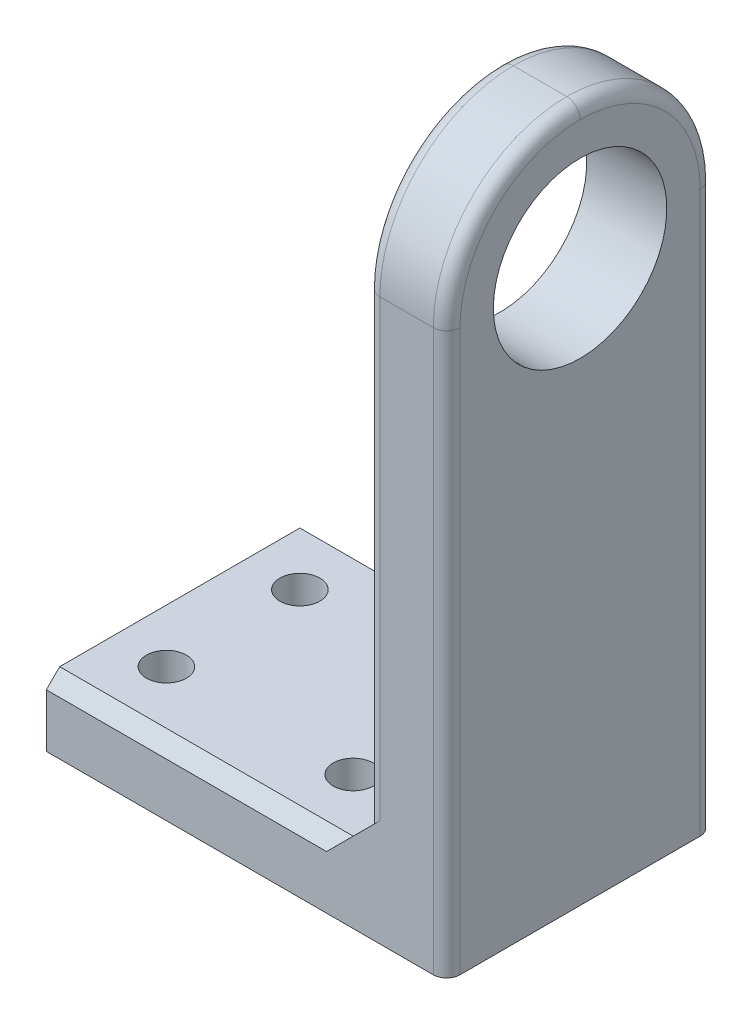
ISO-10303-21;
HEADER;
FILE_DESCRIPTION(('STEP AP214'),'2;1');
FILE_NAME('part.step','',(''),(''),'','','');
FILE_SCHEMA(('AUTOMOTIVE_DESIGN { 1 0 10303 214 1 1 1 1 }'));
ENDSEC;
DATA;
#1=APPLICATION_CONTEXT('core data for automotive mechanical design processes');
#2=APPLICATION_PROTOCOL_DEFINITION('international standard','automotive_design',2000,#1);
#3=PRODUCT_CONTEXT('',#1,'mechanical');
#4=PRODUCT('Part','Part','',(#3));
#5=PRODUCT_RELATED_PRODUCT_CATEGORY('part','',(#4));
#6=PRODUCT_DEFINITION_FORMATION('','',#4);
#7=PRODUCT_DEFINITION_CONTEXT('part definition',#1,'design');
#8=PRODUCT_DEFINITION('design','',#6,#7);
#9=PRODUCT_DEFINITION_SHAPE('','',#8);
#10=(LENGTH_UNIT() NAMED_UNIT(*) SI_UNIT(.MILLI.,.METRE.));
#11=(NAMED_UNIT(*) PLANE_ANGLE_UNIT() SI_UNIT($,.RADIAN.));
#12=(NAMED_UNIT(*) SI_UNIT($,.STERADIAN.) SOLID_ANGLE_UNIT());
#13=UNCERTAINTY_MEASURE_WITH_UNIT(LENGTH_MEASURE(1.E-05),#10,'distance_accuracy_value','');
#14=(GEOMETRIC_REPRESENTATION_CONTEXT(3) GLOBAL_UNCERTAINTY_ASSIGNED_CONTEXT((#13)) GLOBAL_UNIT_ASSIGNED_CONTEXT((#10,
#11,#12)) REPRESENTATION_CONTEXT('',''));
#15=CARTESIAN_POINT('',(0.,0.,0.));
#16=DIRECTION('',(0.,0.,1.));
#17=DIRECTION('',(1.,0.,0.));
#18=AXIS2_PLACEMENT_3D('',#15,#16,#17);
#19=CARTESIAN_POINT('',(0.,5.,0.));
#20=DIRECTION('',(0.,1.,0.));
#21=DIRECTION('',(0.,0.,1.));
#22=AXIS2_PLACEMENT_3D('',#19,#20,#21);
#23=PLANE('',#22);
#24=CARTESIAN_POINT('',(63.,5.,-5.));
#25=DIRECTION('',(0.,1.,0.));
#26=DIRECTION('',(0.,0.,1.));
#27=AXIS2_PLACEMENT_3D('',#24,#25,#26);
#28=CIRCLE('',#27,1.5);
#29=CARTESIAN_POINT('',(63.,5.,-3.5));
#30=VERTEX_POINT('',#29);
#31=EDGE_CURVE('E485',#30,#30,#28,.T.);
#32=ORIENTED_EDGE('',*,*,#31,.F.);
#33=EDGE_LOOP('',(#32));
#34=FACE_BOUND('',#33,.T.);
#35=CARTESIAN_POINT('',(63.,5.,5.));
#36=DIRECTION('',(0.,1.,0.));
#37=DIRECTION('',(0.,0.,1.));
#38=AXIS2_PLACEMENT_3D('',#35,#36,#37);
#39=CIRCLE('',#38,1.5);
#40=CARTESIAN_POINT('',(63.,5.,6.5));
#41=VERTEX_POINT('',#40);
#42=EDGE_CURVE('E482',#41,#41,#39,.T.);
#43=ORIENTED_EDGE('',*,*,#42,.F.);
#44=EDGE_LOOP('',(#43));
#45=FACE_BOUND('',#44,.T.);
#46=CARTESIAN_POINT('',(49.,5.,5.));
#47=DIRECTION('',(0.,1.,0.));
#48=DIRECTION('',(0.,0.,1.));
#49=AXIS2_PLACEMENT_3D('',#46,#47,#48);
#50=CIRCLE('',#49,1.5);
#51=CARTESIAN_POINT('',(49.,5.,6.5));
#52=VERTEX_POINT('',#51);
#53=EDGE_CURVE('E479',#52,#52,#50,.T.);
#54=ORIENTED_EDGE('',*,*,#53,.F.);
#55=EDGE_LOOP('',(#54));
#56=FACE_BOUND('',#55,.T.);
#57=CARTESIAN_POINT('',(49.,5.,-5.00000000000001));
#58=DIRECTION('',(0.,1.,0.));
#59=DIRECTION('',(0.,0.,1.));
#60=AXIS2_PLACEMENT_3D('',#57,#58,#59);
#61=CIRCLE('',#60,1.5);
#62=CARTESIAN_POINT('',(49.,5.,-3.50000000000001));
#63=VERTEX_POINT('',#62);
#64=EDGE_CURVE('E324',#63,#63,#61,.T.);
#65=ORIENTED_EDGE('',*,*,#64,.F.);
#66=EDGE_LOOP('',(#65));
#67=FACE_BOUND('',#66,.T.);
#68=DIRECTION('',(0.,0.,-1.));
#69=VECTOR('',#68,1.);
#70=CARTESIAN_POINT('',(45.,5.,0.));
#71=LINE('',#70,#69);
#72=CARTESIAN_POINT('',(45.,5.,8.99999999999999));
#73=VERTEX_POINT('',#72);
#74=CARTESIAN_POINT('',(45.,5.,-9.));
#75=VERTEX_POINT('',#74);
#76=EDGE_CURVE('E64',#73,#75,#71,.T.);
#77=ORIENTED_EDGE('',*,*,#76,.F.);
#78=DIRECTION('',(1.,0.,0.));
#79=VECTOR('',#78,1.);
#80=CARTESIAN_POINT('',(67.,5.,8.99999999999999));
#81=LINE('',#80,#79);
#82=CARTESIAN_POINT('',(67.,5.,8.99999999999999));
#83=VERTEX_POINT('',#82);
#84=EDGE_CURVE('E305',#73,#83,#81,.T.);
#85=ORIENTED_EDGE('',*,*,#84,.T.);
#86=DIRECTION('',(0.,0.,-1.));
#87=VECTOR('',#86,1.);
#88=CARTESIAN_POINT('',(67.,5.,-10.));
#89=LINE('',#88,#87);
#90=CARTESIAN_POINT('',(67.,5.,-9.));
#91=VERTEX_POINT('',#90);
#92=EDGE_CURVE('E196',#83,#91,#89,.T.);
#93=ORIENTED_EDGE('',*,*,#92,.T.);
#94=DIRECTION('',(-1.,0.,0.));
#95=VECTOR('',#94,1.);
#96=CARTESIAN_POINT('',(-67.,5.,-9.));
#97=LINE('',#96,#95);
#98=EDGE_CURVE('E279',#91,#75,#97,.T.);
#99=ORIENTED_EDGE('',*,*,#98,.T.);
#100=EDGE_LOOP('',(#77,#85,#93,#99));
#101=FACE_BOUND('',#100,.T.);
#102=ADVANCED_FACE('F46',(#34,#45,#56,#67,#101),#23,.T.);
#103=CARTESIAN_POINT('',(75.,5.,-10.));
#104=DIRECTION('',(-1.,0.,0.));
#105=DIRECTION('',(0.,0.,1.));
#106=AXIS2_PLACEMENT_3D('',#103,#104,#105);
#107=PLANE('',#106);
#108=CARTESIAN_POINT('',(75.,42.,0.));
#109=DIRECTION('',(-1.,0.,0.));
#110=DIRECTION('',(0.,0.,1.));
#111=AXIS2_PLACEMENT_3D('',#108,#109,#110);
#112=CIRCLE('',#111,9.);
#113=CARTESIAN_POINT('',(75.,51.,0.));
#114=VERTEX_POINT('',#113);
#115=CARTESIAN_POINT('',(75.,42.,9.));
#116=VERTEX_POINT('',#115);
#117=EDGE_CURVE('E240',#114,#116,#112,.F.);
#118=ORIENTED_EDGE('',*,*,#117,.T.);
#119=DIRECTION('',(0.,-1.,0.));
#120=VECTOR('',#119,1.);
#121=CARTESIAN_POINT('',(75.,5.,9.));
#122=LINE('',#121,#120);
#123=CARTESIAN_POINT('',(75.,0.,9.));
#124=VERTEX_POINT('',#123);
#125=EDGE_CURVE('E243',#116,#124,#122,.T.);
#126=ORIENTED_EDGE('',*,*,#125,.T.);
#127=DIRECTION('',(0.,0.,-1.));
#128=VECTOR('',#127,1.);
#129=CARTESIAN_POINT('',(75.,0.,-10.));
#130=LINE('',#129,#128);
#131=CARTESIAN_POINT('',(75.,0.,-9.));
#132=VERTEX_POINT('',#131);
#133=EDGE_CURVE('E177',#124,#132,#130,.T.);
#134=ORIENTED_EDGE('',*,*,#133,.T.);
#135=DIRECTION('',(0.,-1.,0.));
#136=VECTOR('',#135,1.);
#137=CARTESIAN_POINT('',(75.,5.,-9.));
#138=LINE('',#137,#136);
#139=CARTESIAN_POINT('',(75.,42.,-9.));
#140=VERTEX_POINT('',#139);
#141=EDGE_CURVE('E234',#132,#140,#138,.F.);
#142=ORIENTED_EDGE('',*,*,#141,.T.);
#143=CARTESIAN_POINT('',(75.,42.,0.));
#144=DIRECTION('',(-1.,0.,0.));
#145=DIRECTION('',(0.,0.,1.));
#146=AXIS2_PLACEMENT_3D('',#143,#144,#145);
#147=CIRCLE('',#146,9.);
#148=EDGE_CURVE('E237',#140,#114,#147,.F.);
#149=ORIENTED_EDGE('',*,*,#148,.T.);
#150=EDGE_LOOP('',(#118,#126,#134,#142,#149));
#151=FACE_BOUND('',#150,.T.);
#152=CARTESIAN_POINT('',(75.,42.,0.));
#153=DIRECTION('',(-1.,0.,0.));
#154=DIRECTION('',(0.,0.,1.));
#155=AXIS2_PLACEMENT_3D('',#152,#153,#154);
#156=CIRCLE('',#155,6.5);
#157=CARTESIAN_POINT('',(75.,42.,6.5));
#158=VERTEX_POINT('',#157);
#159=EDGE_CURVE('E201',#158,#158,#156,.T.);
#160=ORIENTED_EDGE('',*,*,#159,.T.);
#161=EDGE_LOOP('',(#160));
#162=FACE_BOUND('',#161,.T.);
#163=ADVANCED_FACE('F352',(#151,#162),#107,.F.);
#164=CARTESIAN_POINT('',(-75.,5.,-10.));
#165=DIRECTION('',(0.,0.,1.));
#166=DIRECTION('',(1.,0.,0.));
#167=AXIS2_PLACEMENT_3D('',#164,#165,#166);
#168=PLANE('',#167);
#169=DIRECTION('',(-1.,0.,0.));
#170=VECTOR('',#169,1.);
#171=CARTESIAN_POINT('',(-75.,0.,-10.));
#172=LINE('',#171,#170);
#173=CARTESIAN_POINT('',(74.,0.,-10.));
#174=VERTEX_POINT('',#173);
#175=CARTESIAN_POINT('',(45.,0.,-10.));
#176=VERTEX_POINT('',#175);
#177=EDGE_CURVE('E166',#174,#176,#172,.T.);
#178=ORIENTED_EDGE('',*,*,#177,.T.);
#179=DIRECTION('',(0.,1.,0.));
#180=VECTOR('',#179,1.);
#181=CARTESIAN_POINT('',(45.,5.,-10.));
#182=LINE('',#181,#180);
#183=CARTESIAN_POINT('',(45.,4.,-10.));
#184=VERTEX_POINT('',#183);
#185=EDGE_CURVE('E154',#176,#184,#182,.T.);
#186=ORIENTED_EDGE('',*,*,#185,.T.);
#187=DIRECTION('',(1.,0.,0.));
#188=VECTOR('',#187,1.);
#189=CARTESIAN_POINT('',(67.,4.,-10.));
#190=LINE('',#189,#188);
#191=CARTESIAN_POINT('',(66.,4.,-10.));
#192=VERTEX_POINT('',#191);
#193=EDGE_CURVE('E72',#184,#192,#190,.T.);
#194=ORIENTED_EDGE('',*,*,#193,.T.);
#195=DIRECTION('',(-0.707106781186543,-0.707106781186552,0.));
#196=VECTOR('',#195,1.);
#197=CARTESIAN_POINT('',(-3.999999999999,-66.,-10.));
#198=LINE('',#197,#196);
#199=CARTESIAN_POINT('',(70.,8.00000000000004,-10.));
#200=VERTEX_POINT('',#199);
#201=EDGE_CURVE('E213',#192,#200,#198,.F.);
#202=ORIENTED_EDGE('',*,*,#201,.T.);
#203=DIRECTION('',(0.,-1.,0.));
#204=VECTOR('',#203,1.);
#205=CARTESIAN_POINT('',(70.,42.,-10.));
#206=LINE('',#205,#204);
#207=CARTESIAN_POINT('',(70.,42.,-10.));
#208=VERTEX_POINT('',#207);
#209=EDGE_CURVE('E216',#200,#208,#206,.F.);
#210=ORIENTED_EDGE('',*,*,#209,.T.);
#211=DIRECTION('',(1.,0.,0.));
#212=VECTOR('',#211,1.);
#213=CARTESIAN_POINT('',(-75.,42.,-10.));
#214=LINE('',#213,#212);
#215=CARTESIAN_POINT('',(74.,42.,-10.));
#216=VERTEX_POINT('',#215);
#217=EDGE_CURVE('E182',#208,#216,#214,.T.);
#218=ORIENTED_EDGE('',*,*,#217,.T.);
#219=DIRECTION('',(0.,-1.,0.));
#220=VECTOR('',#219,1.);
#221=CARTESIAN_POINT('',(74.,5.,-10.));
#222=LINE('',#221,#220);
#223=EDGE_CURVE('E175',#216,#174,#222,.T.);
#224=ORIENTED_EDGE('',*,*,#223,.T.);
#225=EDGE_LOOP('',(#178,#186,#194,#202,#210,#218,#224));
#226=FACE_BOUND('',#225,.T.);
#227=ADVANCED_FACE('F172',(#226),#168,.F.);
#228=CARTESIAN_POINT('',(-75.,5.,10.));
#229=DIRECTION('',(0.,0.,-1.));
#230=DIRECTION('',(-1.,0.,0.));
#231=AXIS2_PLACEMENT_3D('',#228,#229,#230);
#232=PLANE('',#231);
#233=DIRECTION('',(-1.,0.,0.));
#234=VECTOR('',#233,1.);
#235=CARTESIAN_POINT('',(-67.,3.99999999999999,10.));
#236=LINE('',#235,#234);
#237=CARTESIAN_POINT('',(66.,3.99999999999999,10.));
#238=VERTEX_POINT('',#237);
#239=CARTESIAN_POINT('',(45.,3.99999999999999,10.));
#240=VERTEX_POINT('',#239);
#241=EDGE_CURVE('E308',#238,#240,#236,.T.);
#242=ORIENTED_EDGE('',*,*,#241,.T.);
#243=DIRECTION('',(0.,-1.,0.));
#244=VECTOR('',#243,1.);
#245=CARTESIAN_POINT('',(45.,5.,10.));
#246=LINE('',#245,#244);
#247=CARTESIAN_POINT('',(45.,0.,10.));
#248=VERTEX_POINT('',#247);
#249=EDGE_CURVE('E296',#240,#248,#246,.T.);
#250=ORIENTED_EDGE('',*,*,#249,.T.);
#251=DIRECTION('',(1.,0.,0.));
#252=VECTOR('',#251,1.);
#253=CARTESIAN_POINT('',(-75.,0.,10.));
#254=LINE('',#253,#252);
#255=CARTESIAN_POINT('',(74.,0.,10.));
#256=VERTEX_POINT('',#255);
#257=EDGE_CURVE('E169',#248,#256,#254,.T.);
#258=ORIENTED_EDGE('',*,*,#257,.T.);
#259=DIRECTION('',(0.,-1.,0.));
#260=VECTOR('',#259,1.);
#261=CARTESIAN_POINT('',(74.,5.,10.));
#262=LINE('',#261,#260);
#263=CARTESIAN_POINT('',(74.,42.,10.));
#264=VERTEX_POINT('',#263);
#265=EDGE_CURVE('E225',#256,#264,#262,.F.);
#266=ORIENTED_EDGE('',*,*,#265,.T.);
#267=DIRECTION('',(1.,0.,0.));
#268=VECTOR('',#267,1.);
#269=CARTESIAN_POINT('',(-75.,42.,10.));
#270=LINE('',#269,#268);
#271=CARTESIAN_POINT('',(70.,42.,10.));
#272=VERTEX_POINT('',#271);
#273=EDGE_CURVE('E192',#264,#272,#270,.F.);
#274=ORIENTED_EDGE('',*,*,#273,.T.);
#275=DIRECTION('',(0.,1.,0.));
#276=VECTOR('',#275,1.);
#277=CARTESIAN_POINT('',(70.,7.00000000000003,10.));
#278=LINE('',#277,#276);
#279=CARTESIAN_POINT('',(70.,8.00000000000004,10.));
#280=VERTEX_POINT('',#279);
#281=EDGE_CURVE('E221',#272,#280,#278,.F.);
#282=ORIENTED_EDGE('',*,*,#281,.T.);
#283=DIRECTION('',(0.707106781186543,0.707106781186552,0.));
#284=VECTOR('',#283,1.);
#285=CARTESIAN_POINT('',(-3.999999999999,-66.,10.));
#286=LINE('',#285,#284);
#287=EDGE_CURVE('E210',#280,#238,#286,.F.);
#288=ORIENTED_EDGE('',*,*,#287,.T.);
#289=EDGE_LOOP('',(#242,#250,#258,#266,#274,#282,#288));
#290=FACE_BOUND('',#289,.T.);
#291=ADVANCED_FACE('F368',(#290),#232,.F.);
#292=CARTESIAN_POINT('',(0.,0.,0.));
#293=DIRECTION('',(0.,1.,0.));
#294=DIRECTION('',(0.,0.,1.));
#295=AXIS2_PLACEMENT_3D('',#292,#293,#294);
#296=PLANE('',#295);
#297=CARTESIAN_POINT('',(63.,0.,-5.));
#298=DIRECTION('',(0.,1.,0.));
#299=DIRECTION('',(0.,0.,1.));
#300=AXIS2_PLACEMENT_3D('',#297,#298,#299);
#301=CIRCLE('',#300,1.5);
#302=CARTESIAN_POINT('',(63.,0.,-3.5));
#303=VERTEX_POINT('',#302);
#304=EDGE_CURVE('E51',#303,#303,#301,.T.);
#305=ORIENTED_EDGE('',*,*,#304,.T.);
#306=EDGE_LOOP('',(#305));
#307=FACE_BOUND('',#306,.T.);
#308=CARTESIAN_POINT('',(63.,0.,5.));
#309=DIRECTION('',(0.,1.,0.));
#310=DIRECTION('',(0.,0.,1.));
#311=AXIS2_PLACEMENT_3D('',#308,#309,#310);
#312=CIRCLE('',#311,1.5);
#313=CARTESIAN_POINT('',(63.,0.,6.5));
#314=VERTEX_POINT('',#313);
#315=EDGE_CURVE('E327',#314,#314,#312,.T.);
#316=ORIENTED_EDGE('',*,*,#315,.T.);
#317=EDGE_LOOP('',(#316));
#318=FACE_BOUND('',#317,.T.);
#319=CARTESIAN_POINT('',(49.,0.,5.));
#320=DIRECTION('',(0.,1.,0.));
#321=DIRECTION('',(0.,0.,1.));
#322=AXIS2_PLACEMENT_3D('',#319,#320,#321);
#323=CIRCLE('',#322,1.5);
#324=CARTESIAN_POINT('',(49.,0.,6.5));
#325=VERTEX_POINT('',#324);
#326=EDGE_CURVE('E323',#325,#325,#323,.T.);
#327=ORIENTED_EDGE('',*,*,#326,.T.);
#328=EDGE_LOOP('',(#327));
#329=FACE_BOUND('',#328,.T.);
#330=CARTESIAN_POINT('',(49.,0.,-5.00000000000001));
#331=DIRECTION('',(0.,1.,0.));
#332=DIRECTION('',(0.,0.,1.));
#333=AXIS2_PLACEMENT_3D('',#330,#331,#332);
#334=CIRCLE('',#333,1.5);
#335=CARTESIAN_POINT('',(49.,0.,-3.50000000000001));
#336=VERTEX_POINT('',#335);
#337=EDGE_CURVE('E319',#336,#336,#334,.T.);
#338=ORIENTED_EDGE('',*,*,#337,.T.);
#339=EDGE_LOOP('',(#338));
#340=FACE_BOUND('',#339,.T.);
#341=ORIENTED_EDGE('',*,*,#257,.F.);
#342=DIRECTION('',(0.,0.,1.));
#343=VECTOR('',#342,1.);
#344=CARTESIAN_POINT('',(45.,0.,-17.7123982446));
#345=LINE('',#344,#343);
#346=EDGE_CURVE('E157',#176,#248,#345,.T.);
#347=ORIENTED_EDGE('',*,*,#346,.F.);
#348=ORIENTED_EDGE('',*,*,#177,.F.);
#349=CARTESIAN_POINT('',(74.,0.,-9.));
#350=DIRECTION('',(0.,1.,0.));
#351=DIRECTION('',(0.,0.,1.));
#352=AXIS2_PLACEMENT_3D('',#349,#350,#351);
#353=CIRCLE('',#352,1.);
#354=EDGE_CURVE('E228',#174,#132,#353,.F.);
#355=ORIENTED_EDGE('',*,*,#354,.T.);
#356=ORIENTED_EDGE('',*,*,#133,.F.);
#357=CARTESIAN_POINT('',(74.,0.,9.));
#358=DIRECTION('',(0.,1.,0.));
#359=DIRECTION('',(0.,0.,1.));
#360=AXIS2_PLACEMENT_3D('',#357,#358,#359);
#361=CIRCLE('',#360,1.);
#362=EDGE_CURVE('E231',#124,#256,#361,.F.);
#363=ORIENTED_EDGE('',*,*,#362,.T.);
#364=EDGE_LOOP('',(#341,#347,#348,#355,#356,#363));
#365=FACE_BOUND('',#364,.T.);
#366=ADVANCED_FACE('F165',(#307,#318,#329,#340,#365),#296,.F.);
#367=CARTESIAN_POINT('',(69.,0.,0.));
#368=DIRECTION('',(-1.,0.,0.));
#369=DIRECTION('',(0.,0.,-1.));
#370=AXIS2_PLACEMENT_3D('',#367,#368,#369);
#371=PLANE('',#370);
#372=DIRECTION('',(0.,0.,1.));
#373=VECTOR('',#372,1.);
#374=CARTESIAN_POINT('',(69.,7.00000000000003,10.));
#375=LINE('',#374,#373);
#376=CARTESIAN_POINT('',(69.,7.00000000000003,-9.));
#377=VERTEX_POINT('',#376);
#378=CARTESIAN_POINT('',(69.,7.00000000000003,9.));
#379=VERTEX_POINT('',#378);
#380=EDGE_CURVE('E206',#377,#379,#375,.T.);
#381=ORIENTED_EDGE('',*,*,#380,.T.);
#382=DIRECTION('',(0.,1.,0.));
#383=VECTOR('',#382,1.);
#384=CARTESIAN_POINT('',(69.,42.,9.));
#385=LINE('',#384,#383);
#386=CARTESIAN_POINT('',(69.,42.,9.));
#387=VERTEX_POINT('',#386);
#388=EDGE_CURVE('E268',#379,#387,#385,.T.);
#389=ORIENTED_EDGE('',*,*,#388,.T.);
#390=CARTESIAN_POINT('',(69.,42.,0.));
#391=DIRECTION('',(-1.,0.,0.));
#392=DIRECTION('',(0.,0.,1.));
#393=AXIS2_PLACEMENT_3D('',#390,#391,#392);
#394=CIRCLE('',#393,9.);
#395=CARTESIAN_POINT('',(69.,51.,0.));
#396=VERTEX_POINT('',#395);
#397=EDGE_CURVE('E265',#387,#396,#394,.T.);
#398=ORIENTED_EDGE('',*,*,#397,.T.);
#399=CARTESIAN_POINT('',(69.,42.,0.));
#400=DIRECTION('',(-1.,0.,0.));
#401=DIRECTION('',(0.,0.,1.));
#402=AXIS2_PLACEMENT_3D('',#399,#400,#401);
#403=CIRCLE('',#402,9.);
#404=CARTESIAN_POINT('',(69.,42.,-9.));
#405=VERTEX_POINT('',#404);
#406=EDGE_CURVE('E262',#396,#405,#403,.T.);
#407=ORIENTED_EDGE('',*,*,#406,.T.);
#408=DIRECTION('',(0.,-1.,0.));
#409=VECTOR('',#408,1.);
#410=CARTESIAN_POINT('',(69.,7.00000000000003,-9.));
#411=LINE('',#410,#409);
#412=EDGE_CURVE('E259',#405,#377,#411,.T.);
#413=ORIENTED_EDGE('',*,*,#412,.T.);
#414=EDGE_LOOP('',(#381,#389,#398,#407,#413));
#415=FACE_BOUND('',#414,.T.);
#416=CARTESIAN_POINT('',(69.,42.,0.));
#417=DIRECTION('',(-1.,0.,0.));
#418=DIRECTION('',(0.,0.,1.));
#419=AXIS2_PLACEMENT_3D('',#416,#417,#418);
#420=CIRCLE('',#419,6.5);
#421=CARTESIAN_POINT('',(69.,42.,6.5));
#422=VERTEX_POINT('',#421);
#423=EDGE_CURVE('E186',#422,#422,#420,.T.);
#424=ORIENTED_EDGE('',*,*,#423,.F.);
#425=EDGE_LOOP('',(#424));
#426=FACE_BOUND('',#425,.T.);
#427=ADVANCED_FACE('F364',(#415,#426),#371,.T.);
#428=CARTESIAN_POINT('',(69.,42.,0.));
#429=DIRECTION('',(1.,0.,0.));
#430=DIRECTION('',(0.,0.,-1.));
#431=AXIS2_PLACEMENT_3D('',#428,#429,#430);
#432=CYLINDRICAL_SURFACE('',#431,6.5);
#433=ORIENTED_EDGE('',*,*,#423,.T.);
#434=EDGE_LOOP('',(#433));
#435=FACE_BOUND('',#434,.T.);
#436=ORIENTED_EDGE('',*,*,#159,.F.);
#437=EDGE_LOOP('',(#436));
#438=FACE_BOUND('',#437,.T.);
#439=ADVANCED_FACE('F382',(#435,#438),#432,.F.);
#440=CARTESIAN_POINT('',(69.,42.,0.));
#441=DIRECTION('',(1.,0.,0.));
#442=DIRECTION('',(0.,0.,-1.));
#443=AXIS2_PLACEMENT_3D('',#440,#441,#442);
#444=CYLINDRICAL_SURFACE('',#443,10.);
#445=ORIENTED_EDGE('',*,*,#273,.F.);
#446=CARTESIAN_POINT('',(74.,42.,0.));
#447=DIRECTION('',(-1.,0.,0.));
#448=DIRECTION('',(0.,0.,1.));
#449=AXIS2_PLACEMENT_3D('',#446,#447,#448);
#450=CIRCLE('',#449,10.);
#451=CARTESIAN_POINT('',(74.,52.,0.));
#452=VERTEX_POINT('',#451);
#453=EDGE_CURVE('E250',#264,#452,#450,.T.);
#454=ORIENTED_EDGE('',*,*,#453,.T.);
#455=DIRECTION('',(1.,0.,0.));
#456=VECTOR('',#455,1.);
#457=CARTESIAN_POINT('',(69.,52.,0.));
#458=LINE('',#457,#456);
#459=CARTESIAN_POINT('',(70.,52.,0.));
#460=VERTEX_POINT('',#459);
#461=EDGE_CURVE('E197',#460,#452,#458,.T.);
#462=ORIENTED_EDGE('',*,*,#461,.F.);
#463=CARTESIAN_POINT('',(70.,42.,0.));
#464=DIRECTION('',(-1.,0.,0.));
#465=DIRECTION('',(0.,0.,1.));
#466=AXIS2_PLACEMENT_3D('',#463,#464,#465);
#467=CIRCLE('',#466,10.);
#468=EDGE_CURVE('E247',#460,#272,#467,.F.);
#469=ORIENTED_EDGE('',*,*,#468,.T.);
#470=EDGE_LOOP('',(#445,#454,#462,#469));
#471=FACE_BOUND('',#470,.T.);
#472=ADVANCED_FACE('F378',(#471),#444,.T.);
#473=CARTESIAN_POINT('',(-75.,42.,0.));
#474=DIRECTION('',(1.,0.,0.));
#475=DIRECTION('',(0.,0.,-1.));
#476=AXIS2_PLACEMENT_3D('',#473,#474,#475);
#477=CYLINDRICAL_SURFACE('',#476,10.);
#478=ORIENTED_EDGE('',*,*,#461,.T.);
#479=CARTESIAN_POINT('',(74.,42.,0.));
#480=DIRECTION('',(-1.,0.,0.));
#481=DIRECTION('',(0.,0.,1.));
#482=AXIS2_PLACEMENT_3D('',#479,#480,#481);
#483=CIRCLE('',#482,10.);
#484=EDGE_CURVE('E256',#452,#216,#483,.T.);
#485=ORIENTED_EDGE('',*,*,#484,.T.);
#486=ORIENTED_EDGE('',*,*,#217,.F.);
#487=CARTESIAN_POINT('',(70.,42.,0.));
#488=DIRECTION('',(-1.,0.,0.));
#489=DIRECTION('',(0.,0.,1.));
#490=AXIS2_PLACEMENT_3D('',#487,#488,#489);
#491=CIRCLE('',#490,10.);
#492=EDGE_CURVE('E253',#208,#460,#491,.F.);
#493=ORIENTED_EDGE('',*,*,#492,.T.);
#494=EDGE_LOOP('',(#478,#485,#486,#493));
#495=FACE_BOUND('',#494,.T.);
#496=ADVANCED_FACE('F374',(#495),#477,.T.);
#497=CARTESIAN_POINT('',(69.,7.00000000000003,0.));
#498=DIRECTION('',(-0.707106781186552,0.707106781186542,0.));
#499=DIRECTION('',(0.,0.,-1.));
#500=AXIS2_PLACEMENT_3D('',#497,#498,#499);
#501=PLANE('',#500);
#502=ORIENTED_EDGE('',*,*,#201,.F.);
#503=DIRECTION('',(-0.57735026918962,-0.577350269189629,-0.577350269189629));
#504=VECTOR('',#503,1.);
#505=CARTESIAN_POINT('',(71.3333333333333,9.33333333333337,-4.66666666666662));
#506=LINE('',#505,#504);
#507=EDGE_CURVE('E57',#192,#91,#506,.F.);
#508=ORIENTED_EDGE('',*,*,#507,.T.);
#509=ORIENTED_EDGE('',*,*,#92,.F.);
#510=DIRECTION('',(0.57735026918962,0.577350269189629,-0.577350269189629));
#511=VECTOR('',#510,1.);
#512=CARTESIAN_POINT('',(71.3333333333333,9.33333333333337,4.66666666666662));
#513=LINE('',#512,#511);
#514=EDGE_CURVE('E313',#83,#238,#513,.F.);
#515=ORIENTED_EDGE('',*,*,#514,.T.);
#516=ORIENTED_EDGE('',*,*,#287,.F.);
#517=CARTESIAN_POINT('',(70.,8.00000000000004,9.));
#518=DIRECTION('',(-0.707106781186552,0.707106781186542,0.));
#519=DIRECTION('',(-0.707106781186543,-0.707106781186552,0.));
#520=AXIS2_PLACEMENT_3D('',#517,#518,#519);
#521=ELLIPSE('',#520,1.41421356237311,1.);
#522=EDGE_CURVE('E272',#280,#379,#521,.F.);
#523=ORIENTED_EDGE('',*,*,#522,.T.);
#524=ORIENTED_EDGE('',*,*,#380,.F.);
#525=CARTESIAN_POINT('',(70.,8.00000000000004,-9.));
#526=DIRECTION('',(-0.707106781186552,0.707106781186542,0.));
#527=DIRECTION('',(0.707106781186543,0.707106781186552,0.));
#528=AXIS2_PLACEMENT_3D('',#525,#526,#527);
#529=ELLIPSE('',#528,1.41421356237311,1.);
#530=EDGE_CURVE('E275',#377,#200,#529,.F.);
#531=ORIENTED_EDGE('',*,*,#530,.T.);
#532=EDGE_LOOP('',(#502,#508,#509,#515,#516,#523,#524,#531));
#533=FACE_BOUND('',#532,.T.);
#534=ADVANCED_FACE('F377',(#533),#501,.T.);
#535=CARTESIAN_POINT('',(74.,5.,-9.));
#536=DIRECTION('',(0.,-1.,0.));
#537=DIRECTION('',(0.,0.,-1.));
#538=AXIS2_PLACEMENT_3D('',#535,#536,#537);
#539=CYLINDRICAL_SURFACE('',#538,1.);
#540=ORIENTED_EDGE('',*,*,#354,.F.);
#541=ORIENTED_EDGE('',*,*,#223,.F.);
#542=CARTESIAN_POINT('',(74.,42.,-9.));
#543=DIRECTION('',(0.,1.,0.));
#544=DIRECTION('',(0.,0.,1.));
#545=AXIS2_PLACEMENT_3D('',#542,#543,#544);
#546=CIRCLE('',#545,1.);
#547=EDGE_CURVE('E202',#140,#216,#546,.T.);
#548=ORIENTED_EDGE('',*,*,#547,.F.);
#549=ORIENTED_EDGE('',*,*,#141,.F.);
#550=EDGE_LOOP('',(#540,#541,#548,#549));
#551=FACE_BOUND('',#550,.T.);
#552=ADVANCED_FACE('F390',(#551),#539,.T.);
#553=CARTESIAN_POINT('',(74.,42.,0.));
#554=DIRECTION('',(-1.,0.,0.));
#555=DIRECTION('',(0.,0.,1.));
#556=AXIS2_PLACEMENT_3D('',#553,#554,#555);
#557=TOROIDAL_SURFACE('',#556,9.,1.);
#558=ORIENTED_EDGE('',*,*,#547,.T.);
#559=ORIENTED_EDGE('',*,*,#484,.F.);
#560=CARTESIAN_POINT('',(74.,51.,0.));
#561=DIRECTION('',(0.,0.,1.));
#562=DIRECTION('',(1.,0.,0.));
#563=AXIS2_PLACEMENT_3D('',#560,#561,#562);
#564=CIRCLE('',#563,1.);
#565=EDGE_CURVE('E284',#114,#452,#564,.T.);
#566=ORIENTED_EDGE('',*,*,#565,.F.);
#567=ORIENTED_EDGE('',*,*,#148,.F.);
#568=EDGE_LOOP('',(#558,#559,#566,#567));
#569=FACE_BOUND('',#568,.T.);
#570=ADVANCED_FACE('F400',(#569),#557,.T.);
#571=CARTESIAN_POINT('',(74.,42.,0.));
#572=DIRECTION('',(-1.,0.,0.));
#573=DIRECTION('',(0.,0.,1.));
#574=AXIS2_PLACEMENT_3D('',#571,#572,#573);
#575=TOROIDAL_SURFACE('',#574,9.,1.);
#576=ORIENTED_EDGE('',*,*,#565,.T.);
#577=ORIENTED_EDGE('',*,*,#453,.F.);
#578=CARTESIAN_POINT('',(74.,42.,9.));
#579=DIRECTION('',(0.,-1.,0.));
#580=DIRECTION('',(0.,0.,-1.));
#581=AXIS2_PLACEMENT_3D('',#578,#579,#580);
#582=CIRCLE('',#581,1.);
#583=EDGE_CURVE('E280',#116,#264,#582,.T.);
#584=ORIENTED_EDGE('',*,*,#583,.F.);
#585=ORIENTED_EDGE('',*,*,#117,.F.);
#586=EDGE_LOOP('',(#576,#577,#584,#585));
#587=FACE_BOUND('',#586,.T.);
#588=ADVANCED_FACE('F396',(#587),#575,.T.);
#589=CARTESIAN_POINT('',(74.,5.,9.));
#590=DIRECTION('',(0.,-1.,0.));
#591=DIRECTION('',(0.,0.,-1.));
#592=AXIS2_PLACEMENT_3D('',#589,#590,#591);
#593=CYLINDRICAL_SURFACE('',#592,1.);
#594=ORIENTED_EDGE('',*,*,#583,.T.);
#595=ORIENTED_EDGE('',*,*,#265,.F.);
#596=ORIENTED_EDGE('',*,*,#362,.F.);
#597=ORIENTED_EDGE('',*,*,#125,.F.);
#598=EDGE_LOOP('',(#594,#595,#596,#597));
#599=FACE_BOUND('',#598,.T.);
#600=ADVANCED_FACE('F392',(#599),#593,.T.);
#601=CARTESIAN_POINT('',(70.,0.,-9.));
#602=DIRECTION('',(0.,1.,0.));
#603=DIRECTION('',(0.,0.,1.));
#604=AXIS2_PLACEMENT_3D('',#601,#602,#603);
#605=CYLINDRICAL_SURFACE('',#604,1.);
#606=ORIENTED_EDGE('',*,*,#530,.F.);
#607=ORIENTED_EDGE('',*,*,#412,.F.);
#608=CARTESIAN_POINT('',(70.,42.,-9.));
#609=DIRECTION('',(0.,1.,0.));
#610=DIRECTION('',(0.,0.,1.));
#611=AXIS2_PLACEMENT_3D('',#608,#609,#610);
#612=CIRCLE('',#611,1.);
#613=EDGE_CURVE('E285',#208,#405,#612,.T.);
#614=ORIENTED_EDGE('',*,*,#613,.F.);
#615=ORIENTED_EDGE('',*,*,#209,.F.);
#616=EDGE_LOOP('',(#606,#607,#614,#615));
#617=FACE_BOUND('',#616,.T.);
#618=ADVANCED_FACE('F395',(#617),#605,.T.);
#619=CARTESIAN_POINT('',(70.,42.,0.));
#620=DIRECTION('',(-1.,0.,0.));
#621=DIRECTION('',(0.,0.,1.));
#622=AXIS2_PLACEMENT_3D('',#619,#620,#621);
#623=TOROIDAL_SURFACE('',#622,9.,1.);
#624=ORIENTED_EDGE('',*,*,#613,.T.);
#625=ORIENTED_EDGE('',*,*,#406,.F.);
#626=CARTESIAN_POINT('',(70.,51.,0.));
#627=DIRECTION('',(0.,0.,1.));
#628=DIRECTION('',(1.,0.,0.));
#629=AXIS2_PLACEMENT_3D('',#626,#627,#628);
#630=CIRCLE('',#629,1.);
#631=EDGE_CURVE('E295',#460,#396,#630,.T.);
#632=ORIENTED_EDGE('',*,*,#631,.F.);
#633=ORIENTED_EDGE('',*,*,#492,.F.);
#634=EDGE_LOOP('',(#624,#625,#632,#633));
#635=FACE_BOUND('',#634,.T.);
#636=ADVANCED_FACE('F416',(#635),#623,.T.);
#637=CARTESIAN_POINT('',(70.,42.,0.));
#638=DIRECTION('',(-1.,0.,0.));
#639=DIRECTION('',(0.,0.,1.));
#640=AXIS2_PLACEMENT_3D('',#637,#638,#639);
#641=TOROIDAL_SURFACE('',#640,9.,1.);
#642=ORIENTED_EDGE('',*,*,#631,.T.);
#643=ORIENTED_EDGE('',*,*,#397,.F.);
#644=CARTESIAN_POINT('',(70.,42.,9.));
#645=DIRECTION('',(0.,-1.,0.));
#646=DIRECTION('',(0.,0.,-1.));
#647=AXIS2_PLACEMENT_3D('',#644,#645,#646);
#648=CIRCLE('',#647,1.);
#649=EDGE_CURVE('E292',#272,#387,#648,.T.);
#650=ORIENTED_EDGE('',*,*,#649,.F.);
#651=ORIENTED_EDGE('',*,*,#468,.F.);
#652=EDGE_LOOP('',(#642,#643,#650,#651));
#653=FACE_BOUND('',#652,.T.);
#654=ADVANCED_FACE('F412',(#653),#641,.T.);
#655=CARTESIAN_POINT('',(70.,0.,9.));
#656=DIRECTION('',(0.,-1.,0.));
#657=DIRECTION('',(0.,0.,-1.));
#658=AXIS2_PLACEMENT_3D('',#655,#656,#657);
#659=CYLINDRICAL_SURFACE('',#658,1.);
#660=ORIENTED_EDGE('',*,*,#522,.F.);
#661=ORIENTED_EDGE('',*,*,#281,.F.);
#662=ORIENTED_EDGE('',*,*,#649,.T.);
#663=ORIENTED_EDGE('',*,*,#388,.F.);
#664=EDGE_LOOP('',(#660,#661,#662,#663));
#665=FACE_BOUND('',#664,.T.);
#666=ADVANCED_FACE('F408',(#665),#659,.T.);
#667=CARTESIAN_POINT('',(0.,5.,8.99999999999999));
#668=DIRECTION('',(0.,0.707106781186547,0.707106781186547));
#669=DIRECTION('',(-1.,0.,0.));
#670=AXIS2_PLACEMENT_3D('',#667,#668,#669);
#671=PLANE('',#670);
#672=DIRECTION('',(0.,0.707106781186548,-0.707106781186548));
#673=VECTOR('',#672,1.);
#674=CARTESIAN_POINT('',(45.,5.,8.99999999999999));
#675=LINE('',#674,#673);
#676=EDGE_CURVE('E434',#240,#73,#675,.T.);
#677=ORIENTED_EDGE('',*,*,#676,.F.);
#678=ORIENTED_EDGE('',*,*,#241,.F.);
#679=ORIENTED_EDGE('',*,*,#514,.F.);
#680=ORIENTED_EDGE('',*,*,#84,.F.);
#681=EDGE_LOOP('',(#677,#678,#679,#680));
#682=FACE_BOUND('',#681,.T.);
#683=ADVANCED_FACE('F411',(#682),#671,.T.);
#684=CARTESIAN_POINT('',(0.,5.,-9.));
#685=DIRECTION('',(0.,0.707106781186547,-0.707106781186547));
#686=DIRECTION('',(1.,0.,0.));
#687=AXIS2_PLACEMENT_3D('',#684,#685,#686);
#688=PLANE('',#687);
#689=DIRECTION('',(0.,-0.707106781186548,-0.707106781186548));
#690=VECTOR('',#689,1.);
#691=CARTESIAN_POINT('',(45.,5.,-9.));
#692=LINE('',#691,#690);
#693=EDGE_CURVE('E11',#75,#184,#692,.T.);
#694=ORIENTED_EDGE('',*,*,#693,.F.);
#695=ORIENTED_EDGE('',*,*,#98,.F.);
#696=ORIENTED_EDGE('',*,*,#507,.F.);
#697=ORIENTED_EDGE('',*,*,#193,.F.);
#698=EDGE_LOOP('',(#694,#695,#696,#697));
#699=FACE_BOUND('',#698,.T.);
#700=ADVANCED_FACE('F49',(#699),#688,.T.);
#701=CARTESIAN_POINT('',(45.,0.,0.));
#702=DIRECTION('',(1.,0.,0.));
#703=DIRECTION('',(0.,0.,-1.));
#704=AXIS2_PLACEMENT_3D('',#701,#702,#703);
#705=PLANE('',#704);
#706=ORIENTED_EDGE('',*,*,#676,.T.);
#707=ORIENTED_EDGE('',*,*,#76,.T.);
#708=ORIENTED_EDGE('',*,*,#693,.T.);
#709=ORIENTED_EDGE('',*,*,#185,.F.);
#710=ORIENTED_EDGE('',*,*,#346,.T.);
#711=ORIENTED_EDGE('',*,*,#249,.F.);
#712=EDGE_LOOP('',(#706,#707,#708,#709,#710,#711));
#713=FACE_BOUND('',#712,.T.);
#714=ADVANCED_FACE('F156',(#713),#705,.F.);
#715=CARTESIAN_POINT('',(49.,-5.,-5.00000000000001));
#716=DIRECTION('',(0.,1.,0.));
#717=DIRECTION('',(0.,0.,1.));
#718=AXIS2_PLACEMENT_3D('',#715,#716,#717);
#719=CYLINDRICAL_SURFACE('',#718,1.5);
#720=ORIENTED_EDGE('',*,*,#64,.T.);
#721=EDGE_LOOP('',(#720));
#722=FACE_BOUND('',#721,.T.);
#723=ORIENTED_EDGE('',*,*,#337,.F.);
#724=EDGE_LOOP('',(#723));
#725=FACE_BOUND('',#724,.T.);
#726=ADVANCED_FACE('F464',(#722,#725),#719,.F.);
#727=CARTESIAN_POINT('',(49.,-5.,5.));
#728=DIRECTION('',(0.,1.,0.));
#729=DIRECTION('',(0.,0.,1.));
#730=AXIS2_PLACEMENT_3D('',#727,#728,#729);
#731=CYLINDRICAL_SURFACE('',#730,1.5);
#732=ORIENTED_EDGE('',*,*,#53,.T.);
#733=EDGE_LOOP('',(#732));
#734=FACE_BOUND('',#733,.T.);
#735=ORIENTED_EDGE('',*,*,#326,.F.);
#736=EDGE_LOOP('',(#735));
#737=FACE_BOUND('',#736,.T.);
#738=ADVANCED_FACE('F346',(#734,#737),#731,.F.);
#739=CARTESIAN_POINT('',(63.,-5.,5.));
#740=DIRECTION('',(0.,1.,0.));
#741=DIRECTION('',(0.,0.,1.));
#742=AXIS2_PLACEMENT_3D('',#739,#740,#741);
#743=CYLINDRICAL_SURFACE('',#742,1.5);
#744=ORIENTED_EDGE('',*,*,#42,.T.);
#745=EDGE_LOOP('',(#744));
#746=FACE_BOUND('',#745,.T.);
#747=ORIENTED_EDGE('',*,*,#315,.F.);
#748=EDGE_LOOP('',(#747));
#749=FACE_BOUND('',#748,.T.);
#750=ADVANCED_FACE('F340',(#746,#749),#743,.F.);
#751=CARTESIAN_POINT('',(63.,-5.,-5.));
#752=DIRECTION('',(0.,1.,0.));
#753=DIRECTION('',(0.,0.,1.));
#754=AXIS2_PLACEMENT_3D('',#751,#752,#753);
#755=CYLINDRICAL_SURFACE('',#754,1.5);
#756=ORIENTED_EDGE('',*,*,#31,.T.);
#757=EDGE_LOOP('',(#756));
#758=FACE_BOUND('',#757,.T.);
#759=ORIENTED_EDGE('',*,*,#304,.F.);
#760=EDGE_LOOP('',(#759));
#761=FACE_BOUND('',#760,.T.);
#762=ADVANCED_FACE('F338',(#758,#761),#755,.F.);
#763=CLOSED_SHELL('',(#102,#163,#227,#291,#366,#427,#439,#472,#496,#534,#552,#570,#588,#600,
#618,#636,#654,#666,#683,#700,#714,#726,#738,#750,#762));
#764=MANIFOLD_SOLID_BREP('B2',#763);
#765=ADVANCED_BREP_SHAPE_REPRESENTATION('',(#18,#764),#14);
#766=SHAPE_DEFINITION_REPRESENTATION(#9,#765);
ENDSEC;
END-ISO-10303-21;
